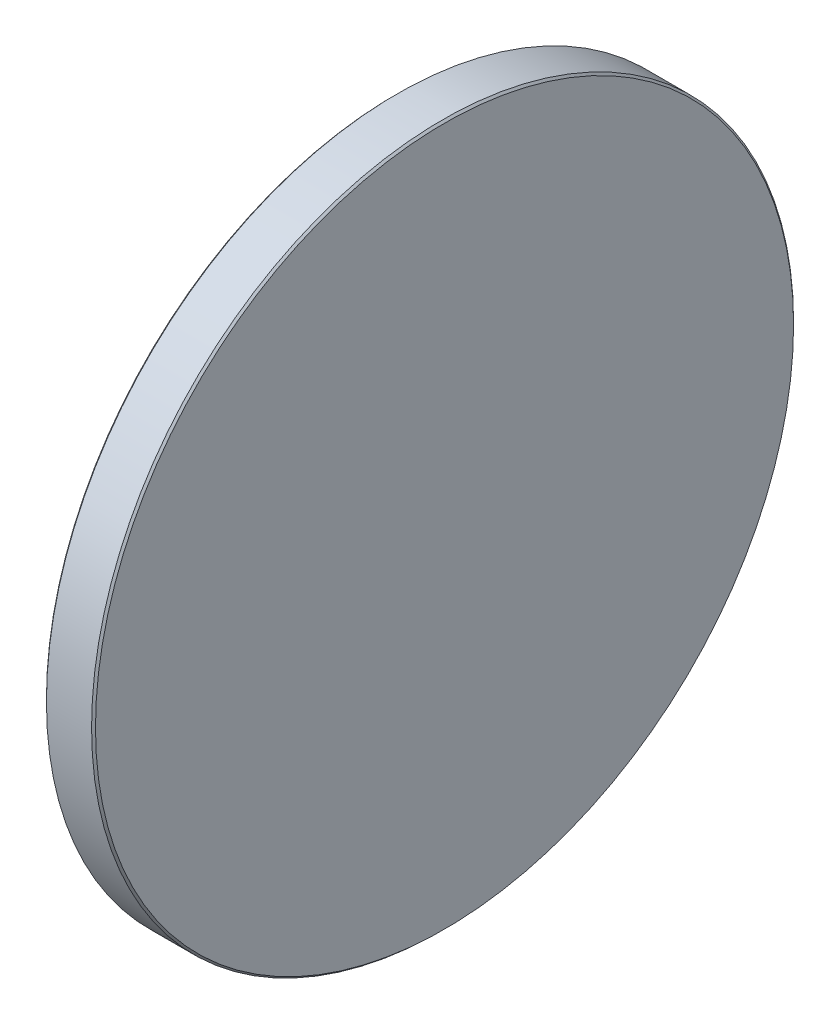
ISO-10303-21;
HEADER;
FILE_DESCRIPTION(('STEP AP214'),'2;1');
FILE_NAME('part.step','',(''),(''),'','','');
FILE_SCHEMA(('AUTOMOTIVE_DESIGN { 1 0 10303 214 1 1 1 1 }'));
ENDSEC;
DATA;
#1=APPLICATION_CONTEXT('core data for automotive mechanical design processes');
#2=APPLICATION_PROTOCOL_DEFINITION('international standard','automotive_design',2000,#1);
#3=PRODUCT_CONTEXT('',#1,'mechanical');
#4=PRODUCT('Part','Part','',(#3));
#5=PRODUCT_RELATED_PRODUCT_CATEGORY('part','',(#4));
#6=PRODUCT_DEFINITION_FORMATION('','',#4);
#7=PRODUCT_DEFINITION_CONTEXT('part definition',#1,'design');
#8=PRODUCT_DEFINITION('design','',#6,#7);
#9=PRODUCT_DEFINITION_SHAPE('','',#8);
#10=(LENGTH_UNIT() NAMED_UNIT(*) SI_UNIT(.MILLI.,.METRE.));
#11=(NAMED_UNIT(*) PLANE_ANGLE_UNIT() SI_UNIT($,.RADIAN.));
#12=(NAMED_UNIT(*) SI_UNIT($,.STERADIAN.) SOLID_ANGLE_UNIT());
#13=UNCERTAINTY_MEASURE_WITH_UNIT(LENGTH_MEASURE(1.E-05),#10,'distance_accuracy_value','');
#14=(GEOMETRIC_REPRESENTATION_CONTEXT(3) GLOBAL_UNCERTAINTY_ASSIGNED_CONTEXT((#13)) GLOBAL_UNIT_ASSIGNED_CONTEXT((#10,
#11,#12)) REPRESENTATION_CONTEXT('',''));
#15=CARTESIAN_POINT('',(0.,0.,0.));
#16=DIRECTION('',(0.,0.,1.));
#17=DIRECTION('',(1.,0.,0.));
#18=AXIS2_PLACEMENT_3D('',#15,#16,#17);
#19=CARTESIAN_POINT('',(-1.775,0.,0.));
#20=DIRECTION('',(1.,0.,0.));
#21=DIRECTION('',(0.,0.,-1.));
#22=AXIS2_PLACEMENT_3D('',#19,#20,#21);
#23=PLANE('',#22);
#24=CARTESIAN_POINT('',(-1.775,0.,0.));
#25=DIRECTION('',(-1.,0.,0.));
#26=DIRECTION('',(0.,0.,1.));
#27=AXIS2_PLACEMENT_3D('',#24,#25,#26);
#28=CIRCLE('',#27,25.2585786437627);
#29=CARTESIAN_POINT('',(-1.775,0.,25.2585786437627));
#30=VERTEX_POINT('',#29);
#31=EDGE_CURVE('E10',#30,#30,#28,.T.);
#32=ORIENTED_EDGE('',*,*,#31,.T.);
#33=EDGE_LOOP('',(#32));
#34=FACE_BOUND('',#33,.T.);
#35=ADVANCED_FACE('F15',(#34),#23,.F.);
#36=CARTESIAN_POINT('',(-1.63357864376269,0.,0.));
#37=DIRECTION('',(1.,0.,0.));
#38=DIRECTION('',(0.,0.,-1.));
#39=AXIS2_PLACEMENT_3D('',#36,#37,#38);
#40=CONICAL_SURFACE('',#39,25.4,0.785398163397451);
#41=ORIENTED_EDGE('',*,*,#31,.F.);
#42=EDGE_LOOP('',(#41));
#43=FACE_BOUND('',#42,.T.);
#44=CARTESIAN_POINT('',(-1.63357864376269,0.,0.));
#45=DIRECTION('',(-1.,0.,0.));
#46=DIRECTION('',(0.,0.,1.));
#47=AXIS2_PLACEMENT_3D('',#44,#45,#46);
#48=CIRCLE('',#47,25.4);
#49=CARTESIAN_POINT('',(-1.63357864376269,0.,25.4));
#50=VERTEX_POINT('',#49);
#51=EDGE_CURVE('E21',#50,#50,#48,.T.);
#52=ORIENTED_EDGE('',*,*,#51,.T.);
#53=EDGE_LOOP('',(#52));
#54=FACE_BOUND('',#53,.T.);
#55=ADVANCED_FACE('F48',(#43,#54),#40,.T.);
#56=CARTESIAN_POINT('',(-1.775,0.,0.));
#57=DIRECTION('',(-1.,0.,0.));
#58=DIRECTION('',(0.,0.,1.));
#59=AXIS2_PLACEMENT_3D('',#56,#57,#58);
#60=CYLINDRICAL_SURFACE('',#59,25.4);
#61=ORIENTED_EDGE('',*,*,#51,.F.);
#62=EDGE_LOOP('',(#61));
#63=FACE_BOUND('',#62,.T.);
#64=CARTESIAN_POINT('',(1.63357864376269,0.,0.));
#65=DIRECTION('',(-1.,0.,0.));
#66=DIRECTION('',(0.,0.,1.));
#67=AXIS2_PLACEMENT_3D('',#64,#65,#66);
#68=CIRCLE('',#67,25.4);
#69=CARTESIAN_POINT('',(1.63357864376269,0.,25.4));
#70=VERTEX_POINT('',#69);
#71=EDGE_CURVE('E25',#70,#70,#68,.T.);
#72=ORIENTED_EDGE('',*,*,#71,.T.);
#73=EDGE_LOOP('',(#72));
#74=FACE_BOUND('',#73,.T.);
#75=ADVANCED_FACE('F44',(#63,#74),#60,.T.);
#76=CARTESIAN_POINT('',(1.775,0.,0.));
#77=DIRECTION('',(-1.,0.,0.));
#78=DIRECTION('',(0.,0.,1.));
#79=AXIS2_PLACEMENT_3D('',#76,#77,#78);
#80=CONICAL_SURFACE('',#79,25.2585786437627,0.785398163397451);
#81=ORIENTED_EDGE('',*,*,#71,.F.);
#82=EDGE_LOOP('',(#81));
#83=FACE_BOUND('',#82,.T.);
#84=CARTESIAN_POINT('',(1.775,0.,0.));
#85=DIRECTION('',(-1.,0.,0.));
#86=DIRECTION('',(0.,0.,1.));
#87=AXIS2_PLACEMENT_3D('',#84,#85,#86);
#88=CIRCLE('',#87,25.2585786437627);
#89=CARTESIAN_POINT('',(1.775,0.,25.2585786437627));
#90=VERTEX_POINT('',#89);
#91=EDGE_CURVE('E29',#90,#90,#88,.T.);
#92=ORIENTED_EDGE('',*,*,#91,.T.);
#93=EDGE_LOOP('',(#92));
#94=FACE_BOUND('',#93,.T.);
#95=ADVANCED_FACE('F35',(#83,#94),#80,.T.);
#96=CARTESIAN_POINT('',(1.775,0.,0.));
#97=DIRECTION('',(-1.,0.,0.));
#98=DIRECTION('',(0.,0.,1.));
#99=AXIS2_PLACEMENT_3D('',#96,#97,#98);
#100=PLANE('',#99);
#101=ORIENTED_EDGE('',*,*,#91,.F.);
#102=EDGE_LOOP('',(#101));
#103=FACE_BOUND('',#102,.T.);
#104=ADVANCED_FACE('F37',(#103),#100,.F.);
#105=CLOSED_SHELL('',(#35,#55,#75,#95,#104));
#106=MANIFOLD_SOLID_BREP('B1',#105);
#107=ADVANCED_BREP_SHAPE_REPRESENTATION('',(#18,#106),#14);
#108=SHAPE_DEFINITION_REPRESENTATION(#9,#107);
ENDSEC;
END-ISO-10303-21;
